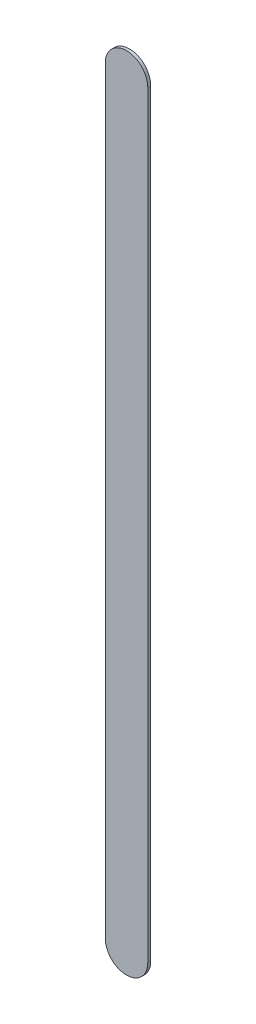
ISO-10303-21;
HEADER;
FILE_DESCRIPTION(('STEP AP214'),'2;1');
FILE_NAME('part.step','',(''),(''),'','','');
FILE_SCHEMA(('AUTOMOTIVE_DESIGN { 1 0 10303 214 1 1 1 1 }'));
ENDSEC;
DATA;
#1=APPLICATION_CONTEXT('core data for automotive mechanical design processes');
#2=APPLICATION_PROTOCOL_DEFINITION('international standard','automotive_design',2000,#1);
#3=PRODUCT_CONTEXT('',#1,'mechanical');
#4=PRODUCT('Part','Part','',(#3));
#5=PRODUCT_RELATED_PRODUCT_CATEGORY('part','',(#4));
#6=PRODUCT_DEFINITION_FORMATION('','',#4);
#7=PRODUCT_DEFINITION_CONTEXT('part definition',#1,'design');
#8=PRODUCT_DEFINITION('design','',#6,#7);
#9=PRODUCT_DEFINITION_SHAPE('','',#8);
#10=(LENGTH_UNIT() NAMED_UNIT(*) SI_UNIT(.MILLI.,.METRE.));
#11=(NAMED_UNIT(*) PLANE_ANGLE_UNIT() SI_UNIT($,.RADIAN.));
#12=(NAMED_UNIT(*) SI_UNIT($,.STERADIAN.) SOLID_ANGLE_UNIT());
#13=UNCERTAINTY_MEASURE_WITH_UNIT(LENGTH_MEASURE(1.E-05),#10,'distance_accuracy_value','');
#14=(GEOMETRIC_REPRESENTATION_CONTEXT(3) GLOBAL_UNCERTAINTY_ASSIGNED_CONTEXT((#13)) GLOBAL_UNIT_ASSIGNED_CONTEXT((#10,
#11,#12)) REPRESENTATION_CONTEXT('',''));
#15=CARTESIAN_POINT('',(0.,0.,0.));
#16=DIRECTION('',(0.,0.,1.));
#17=DIRECTION('',(1.,0.,0.));
#18=AXIS2_PLACEMENT_3D('',#15,#16,#17);
#19=CARTESIAN_POINT('',(75.26,-119.29,1.635));
#20=DIRECTION('',(0.,0.,1.));
#21=DIRECTION('',(1.,0.,0.));
#22=AXIS2_PLACEMENT_3D('',#19,#20,#21);
#23=PLANE('',#22);
#24=DIRECTION('',(0.,-1.,0.));
#25=VECTOR('',#24,1.);
#26=CARTESIAN_POINT('',(75.26,-119.29,1.635));
#27=LINE('',#26,#25);
#28=CARTESIAN_POINT('',(75.26,-119.29,1.635));
#29=VERTEX_POINT('',#28);
#30=CARTESIAN_POINT('',(75.26,-128.21,1.635));
#31=VERTEX_POINT('',#30);
#32=EDGE_CURVE('E99',#29,#31,#27,.T.);
#33=ORIENTED_EDGE('',*,*,#32,.T.);
#34=CARTESIAN_POINT('',(75.51,-128.21,1.635));
#35=DIRECTION('',(0.,0.,1.));
#36=DIRECTION('',(-1.,0.,0.));
#37=AXIS2_PLACEMENT_3D('',#34,#35,#36);
#38=CIRCLE('',#37,0.25);
#39=CARTESIAN_POINT('',(75.76,-128.21,1.635));
#40=VERTEX_POINT('',#39);
#41=EDGE_CURVE('E78',#31,#40,#38,.T.);
#42=ORIENTED_EDGE('',*,*,#41,.T.);
#43=DIRECTION('',(0.,1.,0.));
#44=VECTOR('',#43,1.);
#45=CARTESIAN_POINT('',(75.76,-128.21,1.635));
#46=LINE('',#45,#44);
#47=CARTESIAN_POINT('',(75.76,-119.29,1.635));
#48=VERTEX_POINT('',#47);
#49=EDGE_CURVE('E83',#40,#48,#46,.T.);
#50=ORIENTED_EDGE('',*,*,#49,.T.);
#51=CARTESIAN_POINT('',(75.51,-119.29,1.635));
#52=DIRECTION('',(0.,0.,1.));
#53=DIRECTION('',(1.,0.,0.));
#54=AXIS2_PLACEMENT_3D('',#51,#52,#53);
#55=CIRCLE('',#54,0.25);
#56=EDGE_CURVE('E11',#48,#29,#55,.T.);
#57=ORIENTED_EDGE('',*,*,#56,.T.);
#58=EDGE_LOOP('',(#33,#42,#50,#57));
#59=FACE_BOUND('',#58,.T.);
#60=ADVANCED_FACE('F17',(#59),#23,.T.);
#61=CARTESIAN_POINT('',(75.26,-119.29,1.6));
#62=DIRECTION('',(0.,0.,1.));
#63=DIRECTION('',(1.,0.,0.));
#64=AXIS2_PLACEMENT_3D('',#61,#62,#63);
#65=PLANE('',#64);
#66=CARTESIAN_POINT('',(75.51,-119.29,1.6));
#67=DIRECTION('',(0.,0.,1.));
#68=DIRECTION('',(1.,0.,0.));
#69=AXIS2_PLACEMENT_3D('',#66,#67,#68);
#70=CIRCLE('',#69,0.25);
#71=CARTESIAN_POINT('',(75.76,-119.29,1.6));
#72=VERTEX_POINT('',#71);
#73=CARTESIAN_POINT('',(75.26,-119.29,1.6));
#74=VERTEX_POINT('',#73);
#75=EDGE_CURVE('E21',#72,#74,#70,.T.);
#76=ORIENTED_EDGE('',*,*,#75,.F.);
#77=DIRECTION('',(0.,1.,0.));
#78=VECTOR('',#77,1.);
#79=CARTESIAN_POINT('',(75.76,-128.21,1.6));
#80=LINE('',#79,#78);
#81=CARTESIAN_POINT('',(75.76,-128.21,1.6));
#82=VERTEX_POINT('',#81);
#83=EDGE_CURVE('E69',#82,#72,#80,.T.);
#84=ORIENTED_EDGE('',*,*,#83,.F.);
#85=CARTESIAN_POINT('',(75.51,-128.21,1.6));
#86=DIRECTION('',(0.,0.,1.));
#87=DIRECTION('',(-1.,0.,0.));
#88=AXIS2_PLACEMENT_3D('',#85,#86,#87);
#89=CIRCLE('',#88,0.25);
#90=CARTESIAN_POINT('',(75.26,-128.21,1.6));
#91=VERTEX_POINT('',#90);
#92=EDGE_CURVE('E72',#91,#82,#89,.T.);
#93=ORIENTED_EDGE('',*,*,#92,.F.);
#94=DIRECTION('',(0.,-1.,0.));
#95=VECTOR('',#94,1.);
#96=CARTESIAN_POINT('',(75.26,-119.29,1.6));
#97=LINE('',#96,#95);
#98=EDGE_CURVE('E120',#74,#91,#97,.T.);
#99=ORIENTED_EDGE('',*,*,#98,.F.);
#100=EDGE_LOOP('',(#76,#84,#93,#99));
#101=FACE_BOUND('',#100,.T.);
#102=ADVANCED_FACE('F19',(#101),#65,.F.);
#103=CARTESIAN_POINT('',(75.51,-119.29,1.6));
#104=DIRECTION('',(0.,0.,-1.));
#105=DIRECTION('',(1.,0.,0.));
#106=AXIS2_PLACEMENT_3D('',#103,#104,#105);
#107=CYLINDRICAL_SURFACE('',#106,0.25);
#108=ORIENTED_EDGE('',*,*,#75,.T.);
#109=DIRECTION('',(0.,0.,1.));
#110=VECTOR('',#109,1.);
#111=CARTESIAN_POINT('',(75.26,-119.29,1.6));
#112=LINE('',#111,#110);
#113=EDGE_CURVE('E93',#74,#29,#112,.T.);
#114=ORIENTED_EDGE('',*,*,#113,.T.);
#115=ORIENTED_EDGE('',*,*,#56,.F.);
#116=DIRECTION('',(0.,0.,1.));
#117=VECTOR('',#116,1.);
#118=CARTESIAN_POINT('',(75.76,-119.29,1.6));
#119=LINE('',#118,#117);
#120=EDGE_CURVE('E77',#72,#48,#119,.T.);
#121=ORIENTED_EDGE('',*,*,#120,.F.);
#122=EDGE_LOOP('',(#108,#114,#115,#121));
#123=FACE_BOUND('',#122,.T.);
#124=ADVANCED_FACE('F116',(#123),#107,.T.);
#125=CARTESIAN_POINT('',(75.76,-128.21,1.6));
#126=DIRECTION('',(-1.,0.,0.));
#127=DIRECTION('',(0.,0.,1.));
#128=AXIS2_PLACEMENT_3D('',#125,#126,#127);
#129=PLANE('',#128);
#130=ORIENTED_EDGE('',*,*,#83,.T.);
#131=ORIENTED_EDGE('',*,*,#120,.T.);
#132=ORIENTED_EDGE('',*,*,#49,.F.);
#133=DIRECTION('',(0.,0.,1.));
#134=VECTOR('',#133,1.);
#135=CARTESIAN_POINT('',(75.76,-128.21,1.6));
#136=LINE('',#135,#134);
#137=EDGE_CURVE('E81',#82,#40,#136,.T.);
#138=ORIENTED_EDGE('',*,*,#137,.F.);
#139=EDGE_LOOP('',(#130,#131,#132,#138));
#140=FACE_BOUND('',#139,.T.);
#141=ADVANCED_FACE('F82',(#140),#129,.F.);
#142=CARTESIAN_POINT('',(75.51,-128.21,1.6));
#143=DIRECTION('',(0.,0.,-1.));
#144=DIRECTION('',(-1.,0.,0.));
#145=AXIS2_PLACEMENT_3D('',#142,#143,#144);
#146=CYLINDRICAL_SURFACE('',#145,0.25);
#147=ORIENTED_EDGE('',*,*,#92,.T.);
#148=ORIENTED_EDGE('',*,*,#137,.T.);
#149=ORIENTED_EDGE('',*,*,#41,.F.);
#150=DIRECTION('',(0.,0.,1.));
#151=VECTOR('',#150,1.);
#152=CARTESIAN_POINT('',(75.26,-128.21,1.6));
#153=LINE('',#152,#151);
#154=EDGE_CURVE('E90',#91,#31,#153,.T.);
#155=ORIENTED_EDGE('',*,*,#154,.F.);
#156=EDGE_LOOP('',(#147,#148,#149,#155));
#157=FACE_BOUND('',#156,.T.);
#158=ADVANCED_FACE('F88',(#157),#146,.T.);
#159=CARTESIAN_POINT('',(75.26,-119.29,1.6));
#160=DIRECTION('',(1.,0.,0.));
#161=DIRECTION('',(0.,1.,0.));
#162=AXIS2_PLACEMENT_3D('',#159,#160,#161);
#163=PLANE('',#162);
#164=ORIENTED_EDGE('',*,*,#98,.T.);
#165=ORIENTED_EDGE('',*,*,#154,.T.);
#166=ORIENTED_EDGE('',*,*,#32,.F.);
#167=ORIENTED_EDGE('',*,*,#113,.F.);
#168=EDGE_LOOP('',(#164,#165,#166,#167));
#169=FACE_BOUND('',#168,.T.);
#170=ADVANCED_FACE('F119',(#169),#163,.F.);
#171=CLOSED_SHELL('',(#60,#102,#124,#141,#158,#170));
#172=MANIFOLD_SOLID_BREP('B1',#171);
#173=ADVANCED_BREP_SHAPE_REPRESENTATION('',(#18,#172),#14);
#174=SHAPE_DEFINITION_REPRESENTATION(#9,#173);
ENDSEC;
END-ISO-10303-21;
